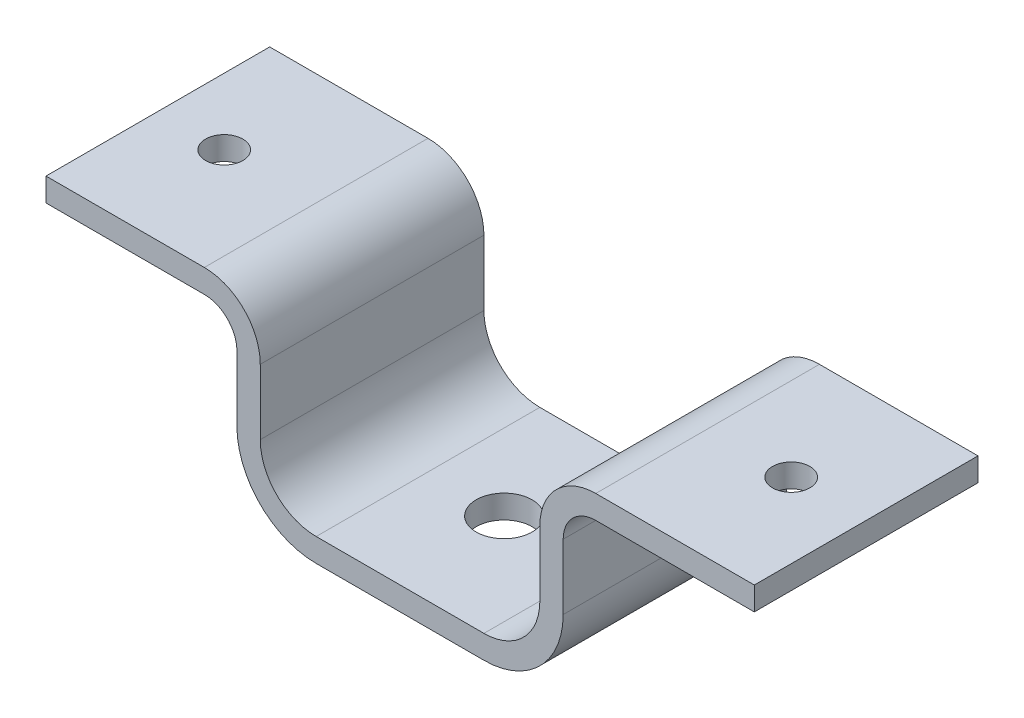
ISO-10303-21;
HEADER;
FILE_DESCRIPTION(('STEP AP214'),'2;1');
FILE_NAME('part.step','',(''),(''),'','','');
FILE_SCHEMA(('AUTOMOTIVE_DESIGN { 1 0 10303 214 1 1 1 1 }'));
ENDSEC;
DATA;
#1=APPLICATION_CONTEXT('core data for automotive mechanical design processes');
#2=APPLICATION_PROTOCOL_DEFINITION('international standard','automotive_design',2000,#1);
#3=PRODUCT_CONTEXT('',#1,'mechanical');
#4=PRODUCT('Part','Part','',(#3));
#5=PRODUCT_RELATED_PRODUCT_CATEGORY('part','',(#4));
#6=PRODUCT_DEFINITION_FORMATION('','',#4);
#7=PRODUCT_DEFINITION_CONTEXT('part definition',#1,'design');
#8=PRODUCT_DEFINITION('design','',#6,#7);
#9=PRODUCT_DEFINITION_SHAPE('','',#8);
#10=(LENGTH_UNIT() NAMED_UNIT(*) SI_UNIT(.MILLI.,.METRE.));
#11=(NAMED_UNIT(*) PLANE_ANGLE_UNIT() SI_UNIT($,.RADIAN.));
#12=(NAMED_UNIT(*) SI_UNIT($,.STERADIAN.) SOLID_ANGLE_UNIT());
#13=UNCERTAINTY_MEASURE_WITH_UNIT(LENGTH_MEASURE(1.E-05),#10,'distance_accuracy_value','');
#14=(GEOMETRIC_REPRESENTATION_CONTEXT(3) GLOBAL_UNCERTAINTY_ASSIGNED_CONTEXT((#13)) GLOBAL_UNIT_ASSIGNED_CONTEXT((#10,
#11,#12)) REPRESENTATION_CONTEXT('',''));
#15=CARTESIAN_POINT('',(0.,0.,0.));
#16=DIRECTION('',(0.,0.,1.));
#17=DIRECTION('',(1.,0.,0.));
#18=AXIS2_PLACEMENT_3D('',#15,#16,#17);
#19=CARTESIAN_POINT('',(-308.473797304987,97.6836027221958,38.1));
#20=DIRECTION('',(1.,0.,0.));
#21=DIRECTION('',(0.,0.,-1.));
#22=AXIS2_PLACEMENT_3D('',#19,#20,#21);
#23=PLANE('',#22);
#24=DIRECTION('',(0.,-1.,0.));
#25=VECTOR('',#24,1.);
#26=CARTESIAN_POINT('',(-308.473797304987,97.6836027221958,-38.1));
#27=LINE('',#26,#25);
#28=CARTESIAN_POINT('',(-308.473797304987,97.6836027221958,-38.1));
#29=VERTEX_POINT('',#28);
#30=CARTESIAN_POINT('',(-308.473797304988,89.7334027221957,-38.1));
#31=VERTEX_POINT('',#30);
#32=EDGE_CURVE('E215',#29,#31,#27,.T.);
#33=ORIENTED_EDGE('',*,*,#32,.T.);
#34=DIRECTION('',(0.,0.,-1.));
#35=VECTOR('',#34,1.);
#36=CARTESIAN_POINT('',(-308.473797304988,89.7334027221957,38.1));
#37=LINE('',#36,#35);
#38=CARTESIAN_POINT('',(-308.473797304988,89.7334027221957,38.1));
#39=VERTEX_POINT('',#38);
#40=EDGE_CURVE('E13',#39,#31,#37,.T.);
#41=ORIENTED_EDGE('',*,*,#40,.F.);
#42=DIRECTION('',(0.,-1.,0.));
#43=VECTOR('',#42,1.);
#44=CARTESIAN_POINT('',(-308.473797304987,97.6836027221958,38.1));
#45=LINE('',#44,#43);
#46=CARTESIAN_POINT('',(-308.473797304987,97.6836027221958,38.1));
#47=VERTEX_POINT('',#46);
#48=EDGE_CURVE('E254',#47,#39,#45,.T.);
#49=ORIENTED_EDGE('',*,*,#48,.F.);
#50=DIRECTION('',(0.,0.,-1.));
#51=VECTOR('',#50,1.);
#52=CARTESIAN_POINT('',(-308.473797304987,97.6836027221958,38.1));
#53=LINE('',#52,#51);
#54=EDGE_CURVE('E211',#47,#29,#53,.T.);
#55=ORIENTED_EDGE('',*,*,#54,.T.);
#56=EDGE_LOOP('',(#33,#41,#49,#55));
#57=FACE_BOUND('',#56,.T.);
#58=ADVANCED_FACE('F46',(#57),#23,.F.);
#59=CARTESIAN_POINT('',(-308.473797304988,89.7334027221957,38.1));
#60=DIRECTION('',(0.,1.,0.));
#61=DIRECTION('',(0.,0.,1.));
#62=AXIS2_PLACEMENT_3D('',#59,#60,#61);
#63=PLANE('',#62);
#64=CARTESIAN_POINT('',(-285.859715501723,89.7334027221957,0.));
#65=DIRECTION('',(0.,1.,0.));
#66=DIRECTION('',(0.,0.,1.));
#67=AXIS2_PLACEMENT_3D('',#64,#65,#66);
#68=CIRCLE('',#67,6.35);
#69=CARTESIAN_POINT('',(-285.859715501723,89.7334027221957,6.35));
#70=VERTEX_POINT('',#69);
#71=EDGE_CURVE('E494',#70,#70,#68,.T.);
#72=ORIENTED_EDGE('',*,*,#71,.T.);
#73=EDGE_LOOP('',(#72));
#74=FACE_BOUND('',#73,.T.);
#75=DIRECTION('',(1.,0.,0.));
#76=VECTOR('',#75,1.);
#77=CARTESIAN_POINT('',(-308.473797304988,89.7334027221957,-38.1));
#78=LINE('',#77,#76);
#79=CARTESIAN_POINT('',(-254.535984298804,89.7334027221957,-38.1));
#80=VERTEX_POINT('',#79);
#81=EDGE_CURVE('E218',#31,#80,#78,.T.);
#82=ORIENTED_EDGE('',*,*,#81,.T.);
#83=DIRECTION('',(0.,0.,-1.));
#84=VECTOR('',#83,1.);
#85=CARTESIAN_POINT('',(-254.535984298804,89.7334027221957,38.1));
#86=LINE('',#85,#84);
#87=CARTESIAN_POINT('',(-254.535984298804,89.7334027221957,38.1));
#88=VERTEX_POINT('',#87);
#89=EDGE_CURVE('E55',#88,#80,#86,.T.);
#90=ORIENTED_EDGE('',*,*,#89,.F.);
#91=DIRECTION('',(1.,0.,0.));
#92=VECTOR('',#91,1.);
#93=CARTESIAN_POINT('',(-308.473797304988,89.7334027221957,38.1));
#94=LINE('',#93,#92);
#95=EDGE_CURVE('E142',#39,#88,#94,.T.);
#96=ORIENTED_EDGE('',*,*,#95,.F.);
#97=ORIENTED_EDGE('',*,*,#40,.T.);
#98=EDGE_LOOP('',(#82,#90,#96,#97));
#99=FACE_BOUND('',#98,.T.);
#100=ADVANCED_FACE('F375',(#74,#99),#63,.F.);
#101=CARTESIAN_POINT('',(-254.535984298804,78.6336027221957,38.1));
#102=DIRECTION('',(0.,0.,-1.));
#103=DIRECTION('',(-1.,0.,0.));
#104=AXIS2_PLACEMENT_3D('',#101,#102,#103);
#105=CYLINDRICAL_SURFACE('',#104,11.0998);
#106=CARTESIAN_POINT('',(-254.535984298804,78.6336027221957,-38.1));
#107=DIRECTION('',(0.,0.,-1.));
#108=DIRECTION('',(-1.,0.,0.));
#109=AXIS2_PLACEMENT_3D('',#106,#107,#108);
#110=CIRCLE('',#109,11.0998);
#111=CARTESIAN_POINT('',(-243.436184298805,78.633602722195,-38.1));
#112=VERTEX_POINT('',#111);
#113=EDGE_CURVE('E221',#80,#112,#110,.T.);
#114=ORIENTED_EDGE('',*,*,#113,.T.);
#115=DIRECTION('',(0.,0.,-1.));
#116=VECTOR('',#115,1.);
#117=CARTESIAN_POINT('',(-243.436184298805,78.633602722195,38.1));
#118=LINE('',#117,#116);
#119=CARTESIAN_POINT('',(-243.436184298805,78.633602722195,38.1));
#120=VERTEX_POINT('',#119);
#121=EDGE_CURVE('E297',#120,#112,#118,.T.);
#122=ORIENTED_EDGE('',*,*,#121,.F.);
#123=CARTESIAN_POINT('',(-254.535984298804,78.6336027221957,38.1));
#124=DIRECTION('',(0.,0.,-1.));
#125=DIRECTION('',(-1.,0.,0.));
#126=AXIS2_PLACEMENT_3D('',#123,#124,#125);
#127=CIRCLE('',#126,11.0998);
#128=EDGE_CURVE('E306',#88,#120,#127,.T.);
#129=ORIENTED_EDGE('',*,*,#128,.F.);
#130=ORIENTED_EDGE('',*,*,#89,.T.);
#131=EDGE_LOOP('',(#114,#122,#129,#130));
#132=FACE_BOUND('',#131,.T.);
#133=ADVANCED_FACE('F304',(#132),#105,.F.);
#134=CARTESIAN_POINT('',(-243.436184298805,78.633602722195,38.1));
#135=DIRECTION('',(1.,0.,0.));
#136=DIRECTION('',(0.,1.,0.));
#137=AXIS2_PLACEMENT_3D('',#134,#135,#136);
#138=PLANE('',#137);
#139=DIRECTION('',(0.,-1.,0.));
#140=VECTOR('',#139,1.);
#141=CARTESIAN_POINT('',(-243.436184298805,78.633602722195,-38.1));
#142=LINE('',#141,#140);
#143=CARTESIAN_POINT('',(-243.436184298804,56.4086027221959,-38.1));
#144=VERTEX_POINT('',#143);
#145=EDGE_CURVE('E223',#112,#144,#142,.T.);
#146=ORIENTED_EDGE('',*,*,#145,.T.);
#147=DIRECTION('',(0.,0.,-1.));
#148=VECTOR('',#147,1.);
#149=CARTESIAN_POINT('',(-243.436184298804,56.4086027221959,38.1));
#150=LINE('',#149,#148);
#151=CARTESIAN_POINT('',(-243.436184298804,56.4086027221959,38.1));
#152=VERTEX_POINT('',#151);
#153=EDGE_CURVE('E294',#152,#144,#150,.T.);
#154=ORIENTED_EDGE('',*,*,#153,.F.);
#155=DIRECTION('',(0.,-1.,0.));
#156=VECTOR('',#155,1.);
#157=CARTESIAN_POINT('',(-243.436184298805,78.633602722195,38.1));
#158=LINE('',#157,#156);
#159=EDGE_CURVE('E324',#120,#152,#158,.T.);
#160=ORIENTED_EDGE('',*,*,#159,.F.);
#161=ORIENTED_EDGE('',*,*,#121,.T.);
#162=EDGE_LOOP('',(#146,#154,#160,#161));
#163=FACE_BOUND('',#162,.T.);
#164=ADVANCED_FACE('F315',(#163),#138,.F.);
#165=CARTESIAN_POINT('',(-216.435984298805,56.4086027221958,38.1));
#166=DIRECTION('',(0.,0.,-1.));
#167=DIRECTION('',(-1.,0.,0.));
#168=AXIS2_PLACEMENT_3D('',#165,#166,#167);
#169=CYLINDRICAL_SURFACE('',#168,27.0002);
#170=CARTESIAN_POINT('',(-216.435984298805,56.4086027221958,-38.1));
#171=DIRECTION('',(0.,0.,1.));
#172=DIRECTION('',(1.,0.,0.));
#173=AXIS2_PLACEMENT_3D('',#170,#171,#172);
#174=CIRCLE('',#173,27.0002);
#175=CARTESIAN_POINT('',(-216.435984298804,29.4084027221957,-38.1));
#176=VERTEX_POINT('',#175);
#177=EDGE_CURVE('E225',#144,#176,#174,.T.);
#178=ORIENTED_EDGE('',*,*,#177,.T.);
#179=DIRECTION('',(0.,0.,-1.));
#180=VECTOR('',#179,1.);
#181=CARTESIAN_POINT('',(-216.435984298804,29.4084027221957,38.1));
#182=LINE('',#181,#180);
#183=CARTESIAN_POINT('',(-216.435984298804,29.4084027221957,38.1));
#184=VERTEX_POINT('',#183);
#185=EDGE_CURVE('E291',#184,#176,#182,.T.);
#186=ORIENTED_EDGE('',*,*,#185,.F.);
#187=CARTESIAN_POINT('',(-216.435984298805,56.4086027221958,38.1));
#188=DIRECTION('',(0.,0.,1.));
#189=DIRECTION('',(1.,0.,0.));
#190=AXIS2_PLACEMENT_3D('',#187,#188,#189);
#191=CIRCLE('',#190,27.0002);
#192=EDGE_CURVE('E321',#152,#184,#191,.T.);
#193=ORIENTED_EDGE('',*,*,#192,.F.);
#194=ORIENTED_EDGE('',*,*,#153,.T.);
#195=EDGE_LOOP('',(#178,#186,#193,#194));
#196=FACE_BOUND('',#195,.T.);
#197=ADVANCED_FACE('F319',(#196),#169,.T.);
#198=CARTESIAN_POINT('',(-216.435984298804,29.4084027221957,38.1));
#199=DIRECTION('',(0.,1.,0.));
#200=DIRECTION('',(-1.,0.,0.));
#201=AXIS2_PLACEMENT_3D('',#198,#199,#200);
#202=PLANE('',#201);
#203=CARTESIAN_POINT('',(-190.5,29.4084027221951,0.));
#204=DIRECTION('',(0.,1.,0.));
#205=DIRECTION('',(-1.,0.,0.));
#206=AXIS2_PLACEMENT_3D('',#203,#204,#205);
#207=CIRCLE('',#206,9.525);
#208=CARTESIAN_POINT('',(-200.025,29.4084027221951,0.));
#209=VERTEX_POINT('',#208);
#210=EDGE_CURVE('E487',#209,#209,#207,.T.);
#211=ORIENTED_EDGE('',*,*,#210,.T.);
#212=EDGE_LOOP('',(#211));
#213=FACE_BOUND('',#212,.T.);
#214=DIRECTION('',(1.,0.,0.));
#215=VECTOR('',#214,1.);
#216=CARTESIAN_POINT('',(-216.435984298804,29.4084027221957,-38.1));
#217=LINE('',#216,#215);
#218=CARTESIAN_POINT('',(-159.285984298804,29.4084027221957,-38.1));
#219=VERTEX_POINT('',#218);
#220=EDGE_CURVE('E227',#176,#219,#217,.T.);
#221=ORIENTED_EDGE('',*,*,#220,.T.);
#222=DIRECTION('',(0.,0.,-1.));
#223=VECTOR('',#222,1.);
#224=CARTESIAN_POINT('',(-159.285984298804,29.4084027221957,38.1));
#225=LINE('',#224,#223);
#226=CARTESIAN_POINT('',(-159.285984298804,29.4084027221957,38.1));
#227=VERTEX_POINT('',#226);
#228=EDGE_CURVE('E288',#227,#219,#225,.T.);
#229=ORIENTED_EDGE('',*,*,#228,.F.);
#230=DIRECTION('',(1.,0.,0.));
#231=VECTOR('',#230,1.);
#232=CARTESIAN_POINT('',(-216.435984298804,29.4084027221957,38.1));
#233=LINE('',#232,#231);
#234=EDGE_CURVE('E323',#184,#227,#233,.T.);
#235=ORIENTED_EDGE('',*,*,#234,.F.);
#236=ORIENTED_EDGE('',*,*,#185,.T.);
#237=EDGE_LOOP('',(#221,#229,#235,#236));
#238=FACE_BOUND('',#237,.T.);
#239=ADVANCED_FACE('F390',(#213,#238),#202,.F.);
#240=CARTESIAN_POINT('',(-159.285984298804,56.4086027221958,38.1));
#241=DIRECTION('',(0.,0.,-1.));
#242=DIRECTION('',(-1.,0.,0.));
#243=AXIS2_PLACEMENT_3D('',#240,#241,#242);
#244=CYLINDRICAL_SURFACE('',#243,27.0002);
#245=CARTESIAN_POINT('',(-159.285984298804,56.4086027221958,-38.1));
#246=DIRECTION('',(0.,0.,1.));
#247=DIRECTION('',(1.,0.,0.));
#248=AXIS2_PLACEMENT_3D('',#245,#246,#247);
#249=CIRCLE('',#248,27.0002);
#250=CARTESIAN_POINT('',(-132.285784298804,56.4086027221959,-38.1));
#251=VERTEX_POINT('',#250);
#252=EDGE_CURVE('E229',#219,#251,#249,.T.);
#253=ORIENTED_EDGE('',*,*,#252,.T.);
#254=DIRECTION('',(0.,0.,-1.));
#255=VECTOR('',#254,1.);
#256=CARTESIAN_POINT('',(-132.285784298804,56.4086027221959,38.1));
#257=LINE('',#256,#255);
#258=CARTESIAN_POINT('',(-132.285784298804,56.4086027221959,38.1));
#259=VERTEX_POINT('',#258);
#260=EDGE_CURVE('E285',#259,#251,#257,.T.);
#261=ORIENTED_EDGE('',*,*,#260,.F.);
#262=CARTESIAN_POINT('',(-159.285984298804,56.4086027221958,38.1));
#263=DIRECTION('',(0.,0.,1.));
#264=DIRECTION('',(1.,0.,0.));
#265=AXIS2_PLACEMENT_3D('',#262,#263,#264);
#266=CIRCLE('',#265,27.0002);
#267=EDGE_CURVE('E326',#227,#259,#266,.T.);
#268=ORIENTED_EDGE('',*,*,#267,.F.);
#269=ORIENTED_EDGE('',*,*,#228,.T.);
#270=EDGE_LOOP('',(#253,#261,#268,#269));
#271=FACE_BOUND('',#270,.T.);
#272=ADVANCED_FACE('F393',(#271),#244,.T.);
#273=CARTESIAN_POINT('',(-132.285784298804,56.4086027221959,38.1));
#274=DIRECTION('',(-1.,0.,0.));
#275=DIRECTION('',(0.,0.,1.));
#276=AXIS2_PLACEMENT_3D('',#273,#274,#275);
#277=PLANE('',#276);
#278=DIRECTION('',(0.,1.,0.));
#279=VECTOR('',#278,1.);
#280=CARTESIAN_POINT('',(-132.285784298804,56.4086027221959,-38.1));
#281=LINE('',#280,#279);
#282=CARTESIAN_POINT('',(-132.285784298804,78.6336027221956,-38.1));
#283=VERTEX_POINT('',#282);
#284=EDGE_CURVE('E231',#251,#283,#281,.T.);
#285=ORIENTED_EDGE('',*,*,#284,.T.);
#286=DIRECTION('',(0.,0.,-1.));
#287=VECTOR('',#286,1.);
#288=CARTESIAN_POINT('',(-132.285784298804,78.6336027221956,38.1));
#289=LINE('',#288,#287);
#290=CARTESIAN_POINT('',(-132.285784298804,78.6336027221956,38.1));
#291=VERTEX_POINT('',#290);
#292=EDGE_CURVE('E282',#291,#283,#289,.T.);
#293=ORIENTED_EDGE('',*,*,#292,.F.);
#294=DIRECTION('',(0.,1.,0.));
#295=VECTOR('',#294,1.);
#296=CARTESIAN_POINT('',(-132.285784298804,56.4086027221959,38.1));
#297=LINE('',#296,#295);
#298=EDGE_CURVE('E332',#259,#291,#297,.T.);
#299=ORIENTED_EDGE('',*,*,#298,.F.);
#300=ORIENTED_EDGE('',*,*,#260,.T.);
#301=EDGE_LOOP('',(#285,#293,#299,#300));
#302=FACE_BOUND('',#301,.T.);
#303=ADVANCED_FACE('F397',(#302),#277,.F.);
#304=CARTESIAN_POINT('',(-121.185984298804,78.6336027221957,38.1));
#305=DIRECTION('',(0.,0.,-1.));
#306=DIRECTION('',(-1.,0.,0.));
#307=AXIS2_PLACEMENT_3D('',#304,#305,#306);
#308=CYLINDRICAL_SURFACE('',#307,11.0998);
#309=CARTESIAN_POINT('',(-121.185984298804,78.6336027221957,-38.1));
#310=DIRECTION('',(0.,0.,-1.));
#311=DIRECTION('',(-1.,0.,0.));
#312=AXIS2_PLACEMENT_3D('',#309,#310,#311);
#313=CIRCLE('',#312,11.0998);
#314=CARTESIAN_POINT('',(-121.185984298804,89.7334027221957,-38.1));
#315=VERTEX_POINT('',#314);
#316=EDGE_CURVE('E233',#283,#315,#313,.T.);
#317=ORIENTED_EDGE('',*,*,#316,.T.);
#318=DIRECTION('',(0.,0.,-1.));
#319=VECTOR('',#318,1.);
#320=CARTESIAN_POINT('',(-121.185984298804,89.7334027221957,38.1));
#321=LINE('',#320,#319);
#322=CARTESIAN_POINT('',(-121.185984298804,89.7334027221957,38.1));
#323=VERTEX_POINT('',#322);
#324=EDGE_CURVE('E279',#323,#315,#321,.T.);
#325=ORIENTED_EDGE('',*,*,#324,.F.);
#326=CARTESIAN_POINT('',(-121.185984298804,78.6336027221957,38.1));
#327=DIRECTION('',(0.,0.,-1.));
#328=DIRECTION('',(-1.,0.,0.));
#329=AXIS2_PLACEMENT_3D('',#326,#327,#328);
#330=CIRCLE('',#329,11.0998);
#331=EDGE_CURVE('E334',#291,#323,#330,.T.);
#332=ORIENTED_EDGE('',*,*,#331,.F.);
#333=ORIENTED_EDGE('',*,*,#292,.T.);
#334=EDGE_LOOP('',(#317,#325,#332,#333));
#335=FACE_BOUND('',#334,.T.);
#336=ADVANCED_FACE('F401',(#335),#308,.F.);
#337=CARTESIAN_POINT('',(-121.185984298804,89.7334027221957,38.1));
#338=DIRECTION('',(0.,1.,0.));
#339=DIRECTION('',(0.,0.,1.));
#340=AXIS2_PLACEMENT_3D('',#337,#338,#339);
#341=PLANE('',#340);
#342=CARTESIAN_POINT('',(-92.7105175434597,89.7334027221956,0.));
#343=DIRECTION('',(0.,1.,0.));
#344=DIRECTION('',(0.,0.,1.));
#345=AXIS2_PLACEMENT_3D('',#342,#343,#344);
#346=CIRCLE('',#345,6.35);
#347=CARTESIAN_POINT('',(-92.7105175434597,89.7334027221956,6.35));
#348=VERTEX_POINT('',#347);
#349=EDGE_CURVE('E219',#348,#348,#346,.T.);
#350=ORIENTED_EDGE('',*,*,#349,.T.);
#351=EDGE_LOOP('',(#350));
#352=FACE_BOUND('',#351,.T.);
#353=DIRECTION('',(1.,0.,0.));
#354=VECTOR('',#353,1.);
#355=CARTESIAN_POINT('',(-121.185984298804,89.7334027221957,-38.1));
#356=LINE('',#355,#354);
#357=CARTESIAN_POINT('',(-67.1737973049871,89.7334027221945,-38.1));
#358=VERTEX_POINT('',#357);
#359=EDGE_CURVE('E235',#315,#358,#356,.T.);
#360=ORIENTED_EDGE('',*,*,#359,.T.);
#361=DIRECTION('',(0.,0.,-1.));
#362=VECTOR('',#361,1.);
#363=CARTESIAN_POINT('',(-67.1737973049871,89.7334027221945,38.1));
#364=LINE('',#363,#362);
#365=CARTESIAN_POINT('',(-67.1737973049871,89.7334027221945,38.1));
#366=VERTEX_POINT('',#365);
#367=EDGE_CURVE('E276',#366,#358,#364,.T.);
#368=ORIENTED_EDGE('',*,*,#367,.F.);
#369=DIRECTION('',(1.,0.,0.));
#370=VECTOR('',#369,1.);
#371=CARTESIAN_POINT('',(-121.185984298804,89.7334027221957,38.1));
#372=LINE('',#371,#370);
#373=EDGE_CURVE('E336',#323,#366,#372,.T.);
#374=ORIENTED_EDGE('',*,*,#373,.F.);
#375=ORIENTED_EDGE('',*,*,#324,.T.);
#376=EDGE_LOOP('',(#360,#368,#374,#375));
#377=FACE_BOUND('',#376,.T.);
#378=ADVANCED_FACE('F405',(#352,#377),#341,.F.);
#379=CARTESIAN_POINT('',(-67.1737973049871,97.6836027221958,38.1));
#380=DIRECTION('',(-1.,0.,0.));
#381=DIRECTION('',(0.,0.,1.));
#382=AXIS2_PLACEMENT_3D('',#379,#380,#381);
#383=PLANE('',#382);
#384=DIRECTION('',(0.,1.,0.));
#385=VECTOR('',#384,1.);
#386=CARTESIAN_POINT('',(-67.1737973049871,97.6836027221958,-38.1));
#387=LINE('',#386,#385);
#388=CARTESIAN_POINT('',(-67.1737973049871,97.6836027221958,-38.1));
#389=VERTEX_POINT('',#388);
#390=EDGE_CURVE('E237',#358,#389,#387,.T.);
#391=ORIENTED_EDGE('',*,*,#390,.T.);
#392=DIRECTION('',(0.,0.,-1.));
#393=VECTOR('',#392,1.);
#394=CARTESIAN_POINT('',(-67.1737973049871,97.6836027221958,38.1));
#395=LINE('',#394,#393);
#396=CARTESIAN_POINT('',(-67.1737973049871,97.6836027221958,38.1));
#397=VERTEX_POINT('',#396);
#398=EDGE_CURVE('E273',#397,#389,#395,.T.);
#399=ORIENTED_EDGE('',*,*,#398,.F.);
#400=DIRECTION('',(0.,1.,0.));
#401=VECTOR('',#400,1.);
#402=CARTESIAN_POINT('',(-67.1737973049871,97.6836027221958,38.1));
#403=LINE('',#402,#401);
#404=EDGE_CURVE('E338',#366,#397,#403,.T.);
#405=ORIENTED_EDGE('',*,*,#404,.F.);
#406=ORIENTED_EDGE('',*,*,#367,.T.);
#407=EDGE_LOOP('',(#391,#399,#405,#406));
#408=FACE_BOUND('',#407,.T.);
#409=ADVANCED_FACE('F409',(#408),#383,.F.);
#410=CARTESIAN_POINT('',(-121.185984298804,97.6836027221958,38.1));
#411=DIRECTION('',(0.,-1.,0.));
#412=DIRECTION('',(1.,0.,0.));
#413=AXIS2_PLACEMENT_3D('',#410,#411,#412);
#414=PLANE('',#413);
#415=CARTESIAN_POINT('',(-92.7105175434597,97.6836027221957,0.));
#416=DIRECTION('',(0.,1.,0.));
#417=DIRECTION('',(0.,0.,1.));
#418=AXIS2_PLACEMENT_3D('',#415,#416,#417);
#419=CIRCLE('',#418,6.35);
#420=CARTESIAN_POINT('',(-92.7105175434597,97.6836027221957,6.35));
#421=VERTEX_POINT('',#420);
#422=EDGE_CURVE('E484',#421,#421,#419,.T.);
#423=ORIENTED_EDGE('',*,*,#422,.F.);
#424=EDGE_LOOP('',(#423));
#425=FACE_BOUND('',#424,.T.);
#426=DIRECTION('',(-1.,0.,0.));
#427=VECTOR('',#426,1.);
#428=CARTESIAN_POINT('',(-121.185984298804,97.6836027221958,-38.1));
#429=LINE('',#428,#427);
#430=CARTESIAN_POINT('',(-121.185984298804,97.6836027221958,-38.1));
#431=VERTEX_POINT('',#430);
#432=EDGE_CURVE('E239',#389,#431,#429,.T.);
#433=ORIENTED_EDGE('',*,*,#432,.T.);
#434=DIRECTION('',(0.,0.,-1.));
#435=VECTOR('',#434,1.);
#436=CARTESIAN_POINT('',(-121.185984298804,97.6836027221958,38.1));
#437=LINE('',#436,#435);
#438=CARTESIAN_POINT('',(-121.185984298804,97.6836027221958,38.1));
#439=VERTEX_POINT('',#438);
#440=EDGE_CURVE('E270',#439,#431,#437,.T.);
#441=ORIENTED_EDGE('',*,*,#440,.F.);
#442=DIRECTION('',(-1.,0.,0.));
#443=VECTOR('',#442,1.);
#444=CARTESIAN_POINT('',(-121.185984298804,97.6836027221958,38.1));
#445=LINE('',#444,#443);
#446=EDGE_CURVE('E340',#397,#439,#445,.T.);
#447=ORIENTED_EDGE('',*,*,#446,.F.);
#448=ORIENTED_EDGE('',*,*,#398,.T.);
#449=EDGE_LOOP('',(#433,#441,#447,#448));
#450=FACE_BOUND('',#449,.T.);
#451=ADVANCED_FACE('F413',(#425,#450),#414,.F.);
#452=CARTESIAN_POINT('',(-121.185984298804,78.6336027221957,38.1));
#453=DIRECTION('',(0.,0.,-1.));
#454=DIRECTION('',(-1.,0.,0.));
#455=AXIS2_PLACEMENT_3D('',#452,#453,#454);
#456=CYLINDRICAL_SURFACE('',#455,19.05);
#457=CARTESIAN_POINT('',(-121.185984298804,78.6336027221957,-38.1));
#458=DIRECTION('',(0.,0.,1.));
#459=DIRECTION('',(-1.,0.,0.));
#460=AXIS2_PLACEMENT_3D('',#457,#458,#459);
#461=CIRCLE('',#460,19.05);
#462=CARTESIAN_POINT('',(-140.235984298804,78.6336027221956,-38.1));
#463=VERTEX_POINT('',#462);
#464=EDGE_CURVE('E241',#431,#463,#461,.T.);
#465=ORIENTED_EDGE('',*,*,#464,.T.);
#466=DIRECTION('',(0.,0.,-1.));
#467=VECTOR('',#466,1.);
#468=CARTESIAN_POINT('',(-140.235984298804,78.6336027221956,38.1));
#469=LINE('',#468,#467);
#470=CARTESIAN_POINT('',(-140.235984298804,78.6336027221956,38.1));
#471=VERTEX_POINT('',#470);
#472=EDGE_CURVE('E267',#471,#463,#469,.T.);
#473=ORIENTED_EDGE('',*,*,#472,.F.);
#474=CARTESIAN_POINT('',(-121.185984298804,78.6336027221957,38.1));
#475=DIRECTION('',(0.,0.,1.));
#476=DIRECTION('',(-1.,0.,0.));
#477=AXIS2_PLACEMENT_3D('',#474,#475,#476);
#478=CIRCLE('',#477,19.05);
#479=EDGE_CURVE('E342',#439,#471,#478,.T.);
#480=ORIENTED_EDGE('',*,*,#479,.F.);
#481=ORIENTED_EDGE('',*,*,#440,.T.);
#482=EDGE_LOOP('',(#465,#473,#480,#481));
#483=FACE_BOUND('',#482,.T.);
#484=ADVANCED_FACE('F417',(#483),#456,.T.);
#485=CARTESIAN_POINT('',(-140.235984298804,56.4086027221954,38.1));
#486=DIRECTION('',(1.,0.,0.));
#487=DIRECTION('',(0.,0.,-1.));
#488=AXIS2_PLACEMENT_3D('',#485,#486,#487);
#489=PLANE('',#488);
#490=DIRECTION('',(0.,-1.,0.));
#491=VECTOR('',#490,1.);
#492=CARTESIAN_POINT('',(-140.235984298804,56.4086027221954,-38.1));
#493=LINE('',#492,#491);
#494=CARTESIAN_POINT('',(-140.235984298804,56.4086027221954,-38.1));
#495=VERTEX_POINT('',#494);
#496=EDGE_CURVE('E243',#463,#495,#493,.T.);
#497=ORIENTED_EDGE('',*,*,#496,.T.);
#498=DIRECTION('',(0.,0.,-1.));
#499=VECTOR('',#498,1.);
#500=CARTESIAN_POINT('',(-140.235984298804,56.4086027221954,38.1));
#501=LINE('',#500,#499);
#502=CARTESIAN_POINT('',(-140.235984298804,56.4086027221954,38.1));
#503=VERTEX_POINT('',#502);
#504=EDGE_CURVE('E264',#503,#495,#501,.T.);
#505=ORIENTED_EDGE('',*,*,#504,.F.);
#506=DIRECTION('',(0.,-1.,0.));
#507=VECTOR('',#506,1.);
#508=CARTESIAN_POINT('',(-140.235984298804,56.4086027221954,38.1));
#509=LINE('',#508,#507);
#510=EDGE_CURVE('E344',#471,#503,#509,.T.);
#511=ORIENTED_EDGE('',*,*,#510,.F.);
#512=ORIENTED_EDGE('',*,*,#472,.T.);
#513=EDGE_LOOP('',(#497,#505,#511,#512));
#514=FACE_BOUND('',#513,.T.);
#515=ADVANCED_FACE('F421',(#514),#489,.F.);
#516=CARTESIAN_POINT('',(-159.285984298804,56.4086027221958,38.1));
#517=DIRECTION('',(0.,0.,-1.));
#518=DIRECTION('',(-1.,0.,0.));
#519=AXIS2_PLACEMENT_3D('',#516,#517,#518);
#520=CYLINDRICAL_SURFACE('',#519,19.05);
#521=CARTESIAN_POINT('',(-159.285984298804,56.4086027221958,-38.1));
#522=DIRECTION('',(0.,0.,-1.));
#523=DIRECTION('',(1.,0.,0.));
#524=AXIS2_PLACEMENT_3D('',#521,#522,#523);
#525=CIRCLE('',#524,19.05);
#526=CARTESIAN_POINT('',(-159.285984298804,37.3586027221957,-38.1));
#527=VERTEX_POINT('',#526);
#528=EDGE_CURVE('E245',#495,#527,#525,.T.);
#529=ORIENTED_EDGE('',*,*,#528,.T.);
#530=DIRECTION('',(0.,0.,-1.));
#531=VECTOR('',#530,1.);
#532=CARTESIAN_POINT('',(-159.285984298804,37.3586027221957,38.1));
#533=LINE('',#532,#531);
#534=CARTESIAN_POINT('',(-159.285984298804,37.3586027221957,38.1));
#535=VERTEX_POINT('',#534);
#536=EDGE_CURVE('E261',#535,#527,#533,.T.);
#537=ORIENTED_EDGE('',*,*,#536,.F.);
#538=CARTESIAN_POINT('',(-159.285984298804,56.4086027221958,38.1));
#539=DIRECTION('',(0.,0.,-1.));
#540=DIRECTION('',(1.,0.,0.));
#541=AXIS2_PLACEMENT_3D('',#538,#539,#540);
#542=CIRCLE('',#541,19.05);
#543=EDGE_CURVE('E346',#503,#535,#542,.T.);
#544=ORIENTED_EDGE('',*,*,#543,.F.);
#545=ORIENTED_EDGE('',*,*,#504,.T.);
#546=EDGE_LOOP('',(#529,#537,#544,#545));
#547=FACE_BOUND('',#546,.T.);
#548=ADVANCED_FACE('F425',(#547),#520,.F.);
#549=CARTESIAN_POINT('',(-216.435984298805,37.358602722196,38.1));
#550=DIRECTION('',(0.,-1.,0.));
#551=DIRECTION('',(0.,0.,-1.));
#552=AXIS2_PLACEMENT_3D('',#549,#550,#551);
#553=PLANE('',#552);
#554=CARTESIAN_POINT('',(-190.5,37.3586027221957,0.));
#555=DIRECTION('',(0.,-1.,0.));
#556=DIRECTION('',(0.,0.,-1.));
#557=AXIS2_PLACEMENT_3D('',#554,#555,#556);
#558=CIRCLE('',#557,9.525);
#559=CARTESIAN_POINT('',(-190.5,37.3586027221957,-9.525));
#560=VERTEX_POINT('',#559);
#561=EDGE_CURVE('E49',#560,#560,#558,.T.);
#562=ORIENTED_EDGE('',*,*,#561,.T.);
#563=EDGE_LOOP('',(#562));
#564=FACE_BOUND('',#563,.T.);
#565=DIRECTION('',(-1.,0.,0.));
#566=VECTOR('',#565,1.);
#567=CARTESIAN_POINT('',(-216.435984298805,37.358602722196,-38.1));
#568=LINE('',#567,#566);
#569=CARTESIAN_POINT('',(-216.435984298805,37.358602722196,-38.1));
#570=VERTEX_POINT('',#569);
#571=EDGE_CURVE('E247',#527,#570,#568,.T.);
#572=ORIENTED_EDGE('',*,*,#571,.T.);
#573=DIRECTION('',(0.,0.,-1.));
#574=VECTOR('',#573,1.);
#575=CARTESIAN_POINT('',(-216.435984298805,37.358602722196,38.1));
#576=LINE('',#575,#574);
#577=CARTESIAN_POINT('',(-216.435984298805,37.358602722196,38.1));
#578=VERTEX_POINT('',#577);
#579=EDGE_CURVE('E258',#578,#570,#576,.T.);
#580=ORIENTED_EDGE('',*,*,#579,.F.);
#581=DIRECTION('',(-1.,0.,0.));
#582=VECTOR('',#581,1.);
#583=CARTESIAN_POINT('',(-216.435984298805,37.358602722196,38.1));
#584=LINE('',#583,#582);
#585=EDGE_CURVE('E348',#535,#578,#584,.T.);
#586=ORIENTED_EDGE('',*,*,#585,.F.);
#587=ORIENTED_EDGE('',*,*,#536,.T.);
#588=EDGE_LOOP('',(#572,#580,#586,#587));
#589=FACE_BOUND('',#588,.T.);
#590=ADVANCED_FACE('F354',(#564,#589),#553,.F.);
#591=CARTESIAN_POINT('',(-216.435984298805,56.4086027221958,38.1));
#592=DIRECTION('',(0.,0.,-1.));
#593=DIRECTION('',(-1.,0.,0.));
#594=AXIS2_PLACEMENT_3D('',#591,#592,#593);
#595=CYLINDRICAL_SURFACE('',#594,19.05);
#596=CARTESIAN_POINT('',(-216.435984298805,56.4086027221958,-38.1));
#597=DIRECTION('',(0.,0.,-1.));
#598=DIRECTION('',(1.,0.,0.));
#599=AXIS2_PLACEMENT_3D('',#596,#597,#598);
#600=CIRCLE('',#599,19.05);
#601=CARTESIAN_POINT('',(-235.485984298805,56.4086027221962,-38.1));
#602=VERTEX_POINT('',#601);
#603=EDGE_CURVE('E249',#570,#602,#600,.T.);
#604=ORIENTED_EDGE('',*,*,#603,.T.);
#605=DIRECTION('',(0.,0.,-1.));
#606=VECTOR('',#605,1.);
#607=CARTESIAN_POINT('',(-235.485984298805,56.4086027221962,38.1));
#608=LINE('',#607,#606);
#609=CARTESIAN_POINT('',(-235.485984298805,56.4086027221962,38.1));
#610=VERTEX_POINT('',#609);
#611=EDGE_CURVE('E206',#610,#602,#608,.T.);
#612=ORIENTED_EDGE('',*,*,#611,.F.);
#613=CARTESIAN_POINT('',(-216.435984298805,56.4086027221958,38.1));
#614=DIRECTION('',(0.,0.,-1.));
#615=DIRECTION('',(1.,0.,0.));
#616=AXIS2_PLACEMENT_3D('',#613,#614,#615);
#617=CIRCLE('',#616,19.05);
#618=EDGE_CURVE('E197',#578,#610,#617,.T.);
#619=ORIENTED_EDGE('',*,*,#618,.F.);
#620=ORIENTED_EDGE('',*,*,#579,.T.);
#621=EDGE_LOOP('',(#604,#612,#619,#620));
#622=FACE_BOUND('',#621,.T.);
#623=ADVANCED_FACE('F358',(#622),#595,.F.);
#624=CARTESIAN_POINT('',(-235.485984298805,78.6336027221957,38.1));
#625=DIRECTION('',(-1.,0.,0.));
#626=DIRECTION('',(0.,-1.,0.));
#627=AXIS2_PLACEMENT_3D('',#624,#625,#626);
#628=PLANE('',#627);
#629=DIRECTION('',(0.,1.,0.));
#630=VECTOR('',#629,1.);
#631=CARTESIAN_POINT('',(-235.485984298805,78.6336027221957,-38.1));
#632=LINE('',#631,#630);
#633=CARTESIAN_POINT('',(-235.485984298805,78.6336027221957,-38.1));
#634=VERTEX_POINT('',#633);
#635=EDGE_CURVE('E205',#602,#634,#632,.T.);
#636=ORIENTED_EDGE('',*,*,#635,.T.);
#637=DIRECTION('',(0.,0.,-1.));
#638=VECTOR('',#637,1.);
#639=CARTESIAN_POINT('',(-235.485984298805,78.6336027221957,38.1));
#640=LINE('',#639,#638);
#641=CARTESIAN_POINT('',(-235.485984298805,78.6336027221957,38.1));
#642=VERTEX_POINT('',#641);
#643=EDGE_CURVE('E202',#642,#634,#640,.T.);
#644=ORIENTED_EDGE('',*,*,#643,.F.);
#645=DIRECTION('',(0.,1.,0.));
#646=VECTOR('',#645,1.);
#647=CARTESIAN_POINT('',(-235.485984298805,78.6336027221957,38.1));
#648=LINE('',#647,#646);
#649=EDGE_CURVE('E191',#610,#642,#648,.T.);
#650=ORIENTED_EDGE('',*,*,#649,.F.);
#651=ORIENTED_EDGE('',*,*,#611,.T.);
#652=EDGE_LOOP('',(#636,#644,#650,#651));
#653=FACE_BOUND('',#652,.T.);
#654=ADVANCED_FACE('F203',(#653),#628,.F.);
#655=CARTESIAN_POINT('',(-254.535984298804,78.6336027221957,38.1));
#656=DIRECTION('',(0.,0.,-1.));
#657=DIRECTION('',(-1.,0.,0.));
#658=AXIS2_PLACEMENT_3D('',#655,#656,#657);
#659=CYLINDRICAL_SURFACE('',#658,19.05);
#660=CARTESIAN_POINT('',(-254.535984298804,78.6336027221957,-38.1));
#661=DIRECTION('',(0.,0.,1.));
#662=DIRECTION('',(-1.,0.,0.));
#663=AXIS2_PLACEMENT_3D('',#660,#661,#662);
#664=CIRCLE('',#663,19.05);
#665=CARTESIAN_POINT('',(-254.535984298804,97.6836027221958,-38.1));
#666=VERTEX_POINT('',#665);
#667=EDGE_CURVE('E128',#634,#666,#664,.T.);
#668=ORIENTED_EDGE('',*,*,#667,.T.);
#669=DIRECTION('',(0.,0.,-1.));
#670=VECTOR('',#669,1.);
#671=CARTESIAN_POINT('',(-254.535984298804,97.6836027221958,38.1));
#672=LINE('',#671,#670);
#673=CARTESIAN_POINT('',(-254.535984298804,97.6836027221958,38.1));
#674=VERTEX_POINT('',#673);
#675=EDGE_CURVE('E207',#674,#666,#672,.T.);
#676=ORIENTED_EDGE('',*,*,#675,.F.);
#677=CARTESIAN_POINT('',(-254.535984298804,78.6336027221957,38.1));
#678=DIRECTION('',(0.,0.,1.));
#679=DIRECTION('',(-1.,0.,0.));
#680=AXIS2_PLACEMENT_3D('',#677,#678,#679);
#681=CIRCLE('',#680,19.05);
#682=EDGE_CURVE('E195',#642,#674,#681,.T.);
#683=ORIENTED_EDGE('',*,*,#682,.F.);
#684=ORIENTED_EDGE('',*,*,#643,.T.);
#685=EDGE_LOOP('',(#668,#676,#683,#684));
#686=FACE_BOUND('',#685,.T.);
#687=ADVANCED_FACE('F209',(#686),#659,.T.);
#688=CARTESIAN_POINT('',(-308.473797304987,97.6836027221958,38.1));
#689=DIRECTION('',(0.,-1.,0.));
#690=DIRECTION('',(0.,0.,-1.));
#691=AXIS2_PLACEMENT_3D('',#688,#689,#690);
#692=PLANE('',#691);
#693=CARTESIAN_POINT('',(-285.859715501721,97.6836027221958,0.));
#694=DIRECTION('',(0.,1.,0.));
#695=DIRECTION('',(0.,0.,1.));
#696=AXIS2_PLACEMENT_3D('',#693,#694,#695);
#697=CIRCLE('',#696,6.35);
#698=CARTESIAN_POINT('',(-285.859715501721,97.6836027221958,6.35));
#699=VERTEX_POINT('',#698);
#700=EDGE_CURVE('E496',#699,#699,#697,.T.);
#701=ORIENTED_EDGE('',*,*,#700,.F.);
#702=EDGE_LOOP('',(#701));
#703=FACE_BOUND('',#702,.T.);
#704=DIRECTION('',(-1.,0.,0.));
#705=VECTOR('',#704,1.);
#706=CARTESIAN_POINT('',(-308.473797304987,97.6836027221958,-38.1));
#707=LINE('',#706,#705);
#708=EDGE_CURVE('E134',#666,#29,#707,.T.);
#709=ORIENTED_EDGE('',*,*,#708,.T.);
#710=ORIENTED_EDGE('',*,*,#54,.F.);
#711=DIRECTION('',(-1.,0.,0.));
#712=VECTOR('',#711,1.);
#713=CARTESIAN_POINT('',(-308.473797304987,97.6836027221958,38.1));
#714=LINE('',#713,#712);
#715=EDGE_CURVE('E63',#674,#47,#714,.T.);
#716=ORIENTED_EDGE('',*,*,#715,.F.);
#717=ORIENTED_EDGE('',*,*,#675,.T.);
#718=EDGE_LOOP('',(#709,#710,#716,#717));
#719=FACE_BOUND('',#718,.T.);
#720=ADVANCED_FACE('F362',(#703,#719),#692,.F.);
#721=CARTESIAN_POINT('',(-254.535984298804,78.6336027221957,38.1));
#722=DIRECTION('',(0.,0.,-1.));
#723=DIRECTION('',(-1.,0.,0.));
#724=AXIS2_PLACEMENT_3D('',#721,#722,#723);
#725=PLANE('',#724);
#726=ORIENTED_EDGE('',*,*,#48,.T.);
#727=ORIENTED_EDGE('',*,*,#95,.T.);
#728=ORIENTED_EDGE('',*,*,#128,.T.);
#729=ORIENTED_EDGE('',*,*,#159,.T.);
#730=ORIENTED_EDGE('',*,*,#192,.T.);
#731=ORIENTED_EDGE('',*,*,#234,.T.);
#732=ORIENTED_EDGE('',*,*,#267,.T.);
#733=ORIENTED_EDGE('',*,*,#298,.T.);
#734=ORIENTED_EDGE('',*,*,#331,.T.);
#735=ORIENTED_EDGE('',*,*,#373,.T.);
#736=ORIENTED_EDGE('',*,*,#404,.T.);
#737=ORIENTED_EDGE('',*,*,#446,.T.);
#738=ORIENTED_EDGE('',*,*,#479,.T.);
#739=ORIENTED_EDGE('',*,*,#510,.T.);
#740=ORIENTED_EDGE('',*,*,#543,.T.);
#741=ORIENTED_EDGE('',*,*,#585,.T.);
#742=ORIENTED_EDGE('',*,*,#618,.T.);
#743=ORIENTED_EDGE('',*,*,#649,.T.);
#744=ORIENTED_EDGE('',*,*,#682,.T.);
#745=ORIENTED_EDGE('',*,*,#715,.T.);
#746=EDGE_LOOP('',(#726,#727,#728,#729,#730,#731,#732,#733,#734,#735,#736,#737,#738,#739,#740,
#741,#742,#743,#744,#745));
#747=FACE_BOUND('',#746,.T.);
#748=ADVANCED_FACE('F193',(#747),#725,.F.);
#749=CARTESIAN_POINT('',(-254.535984298804,78.6336027221957,-38.1));
#750=DIRECTION('',(0.,0.,-1.));
#751=DIRECTION('',(-1.,0.,0.));
#752=AXIS2_PLACEMENT_3D('',#749,#750,#751);
#753=PLANE('',#752);
#754=ORIENTED_EDGE('',*,*,#32,.F.);
#755=ORIENTED_EDGE('',*,*,#708,.F.);
#756=ORIENTED_EDGE('',*,*,#667,.F.);
#757=ORIENTED_EDGE('',*,*,#635,.F.);
#758=ORIENTED_EDGE('',*,*,#603,.F.);
#759=ORIENTED_EDGE('',*,*,#571,.F.);
#760=ORIENTED_EDGE('',*,*,#528,.F.);
#761=ORIENTED_EDGE('',*,*,#496,.F.);
#762=ORIENTED_EDGE('',*,*,#464,.F.);
#763=ORIENTED_EDGE('',*,*,#432,.F.);
#764=ORIENTED_EDGE('',*,*,#390,.F.);
#765=ORIENTED_EDGE('',*,*,#359,.F.);
#766=ORIENTED_EDGE('',*,*,#316,.F.);
#767=ORIENTED_EDGE('',*,*,#284,.F.);
#768=ORIENTED_EDGE('',*,*,#252,.F.);
#769=ORIENTED_EDGE('',*,*,#220,.F.);
#770=ORIENTED_EDGE('',*,*,#177,.F.);
#771=ORIENTED_EDGE('',*,*,#145,.F.);
#772=ORIENTED_EDGE('',*,*,#113,.F.);
#773=ORIENTED_EDGE('',*,*,#81,.F.);
#774=EDGE_LOOP('',(#754,#755,#756,#757,#758,#759,#760,#761,#762,#763,#764,#765,#766,#767,#768,
#769,#770,#771,#772,#773));
#775=FACE_BOUND('',#774,.T.);
#776=ADVANCED_FACE('F310',(#775),#753,.T.);
#777=CARTESIAN_POINT('',(-285.859715501723,21.483602722196,0.));
#778=DIRECTION('',(0.,1.,0.));
#779=DIRECTION('',(0.,0.,1.));
#780=AXIS2_PLACEMENT_3D('',#777,#778,#779);
#781=CYLINDRICAL_SURFACE('',#780,6.35);
#782=ORIENTED_EDGE('',*,*,#700,.T.);
#783=EDGE_LOOP('',(#782));
#784=FACE_BOUND('',#783,.T.);
#785=ORIENTED_EDGE('',*,*,#71,.F.);
#786=EDGE_LOOP('',(#785));
#787=FACE_BOUND('',#786,.T.);
#788=ADVANCED_FACE('F457',(#784,#787),#781,.F.);
#789=CARTESIAN_POINT('',(-190.5,21.4836027221957,0.));
#790=DIRECTION('',(0.,1.,0.));
#791=DIRECTION('',(0.,0.,1.));
#792=AXIS2_PLACEMENT_3D('',#789,#790,#791);
#793=CYLINDRICAL_SURFACE('',#792,9.525);
#794=ORIENTED_EDGE('',*,*,#561,.F.);
#795=EDGE_LOOP('',(#794));
#796=FACE_BOUND('',#795,.T.);
#797=ORIENTED_EDGE('',*,*,#210,.F.);
#798=EDGE_LOOP('',(#797));
#799=FACE_BOUND('',#798,.T.);
#800=ADVANCED_FACE('F463',(#796,#799),#793,.F.);
#801=CARTESIAN_POINT('',(-92.7105175434598,21.4836027221953,0.));
#802=DIRECTION('',(0.,1.,0.));
#803=DIRECTION('',(0.,0.,1.));
#804=AXIS2_PLACEMENT_3D('',#801,#802,#803);
#805=CYLINDRICAL_SURFACE('',#804,6.35);
#806=ORIENTED_EDGE('',*,*,#422,.T.);
#807=EDGE_LOOP('',(#806));
#808=FACE_BOUND('',#807,.T.);
#809=ORIENTED_EDGE('',*,*,#349,.F.);
#810=EDGE_LOOP('',(#809));
#811=FACE_BOUND('',#810,.T.);
#812=ADVANCED_FACE('F471',(#808,#811),#805,.F.);
#813=CLOSED_SHELL('',(#58,#100,#133,#164,#197,#239,#272,#303,#336,#378,#409,#451,#484,#515,#548,
#590,#623,#654,#687,#720,#748,#776,#788,#800,#812));
#814=MANIFOLD_SOLID_BREP('B2',#813);
#815=ADVANCED_BREP_SHAPE_REPRESENTATION('',(#18,#814),#14);
#816=SHAPE_DEFINITION_REPRESENTATION(#9,#815);
ENDSEC;
END-ISO-10303-21;
